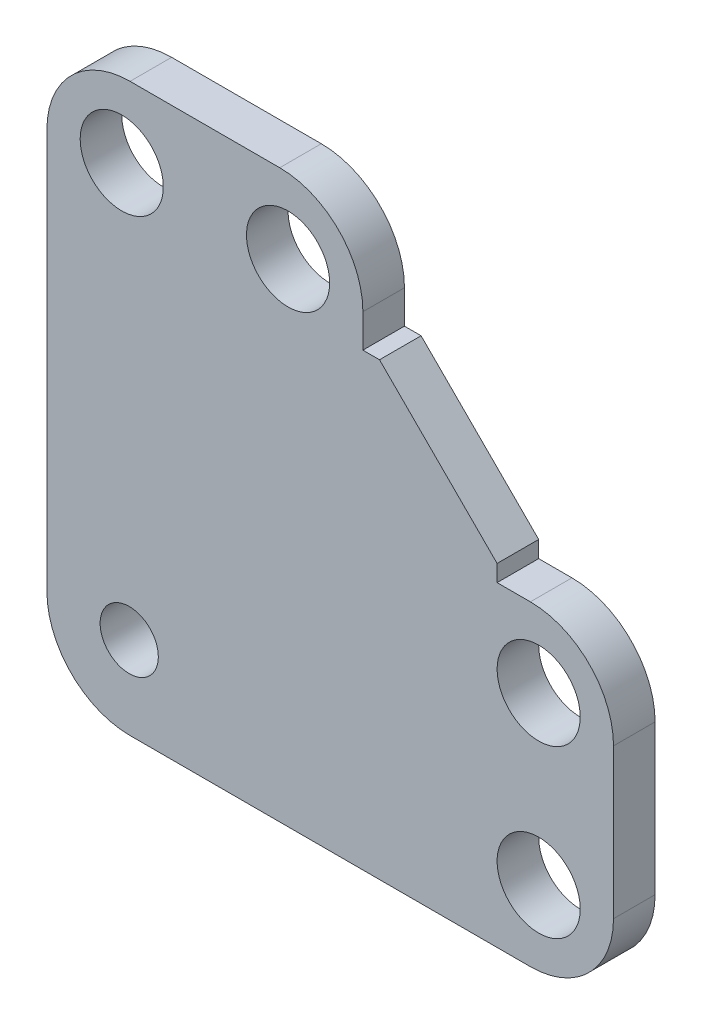
ISO-10303-21;
HEADER;
FILE_DESCRIPTION(('STEP AP214'),'2;1');
FILE_NAME('part.step','',(''),(''),'','','');
FILE_SCHEMA(('AUTOMOTIVE_DESIGN { 1 0 10303 214 1 1 1 1 }'));
ENDSEC;
DATA;
#1=APPLICATION_CONTEXT('core data for automotive mechanical design processes');
#2=APPLICATION_PROTOCOL_DEFINITION('international standard','automotive_design',2000,#1);
#3=PRODUCT_CONTEXT('',#1,'mechanical');
#4=PRODUCT('Part','Part','',(#3));
#5=PRODUCT_RELATED_PRODUCT_CATEGORY('part','',(#4));
#6=PRODUCT_DEFINITION_FORMATION('','',#4);
#7=PRODUCT_DEFINITION_CONTEXT('part definition',#1,'design');
#8=PRODUCT_DEFINITION('design','',#6,#7);
#9=PRODUCT_DEFINITION_SHAPE('','',#8);
#10=(LENGTH_UNIT() NAMED_UNIT(*) SI_UNIT(.MILLI.,.METRE.));
#11=(NAMED_UNIT(*) PLANE_ANGLE_UNIT() SI_UNIT($,.RADIAN.));
#12=(NAMED_UNIT(*) SI_UNIT($,.STERADIAN.) SOLID_ANGLE_UNIT());
#13=UNCERTAINTY_MEASURE_WITH_UNIT(LENGTH_MEASURE(1.E-05),#10,'distance_accuracy_value','');
#14=(GEOMETRIC_REPRESENTATION_CONTEXT(3) GLOBAL_UNCERTAINTY_ASSIGNED_CONTEXT((#13)) GLOBAL_UNIT_ASSIGNED_CONTEXT((#10,
#11,#12)) REPRESENTATION_CONTEXT('',''));
#15=CARTESIAN_POINT('',(0.,0.,0.));
#16=DIRECTION('',(0.,0.,1.));
#17=DIRECTION('',(1.,0.,0.));
#18=AXIS2_PLACEMENT_3D('',#15,#16,#17);
#19=CARTESIAN_POINT('',(54.1421356237309,0.,5.));
#20=DIRECTION('',(-1.,0.,0.));
#21=DIRECTION('',(0.,0.,1.));
#22=AXIS2_PLACEMENT_3D('',#19,#20,#21);
#23=PLANE('',#22);
#24=DIRECTION('',(0.,0.,1.));
#25=VECTOR('',#24,1.);
#26=CARTESIAN_POINT('',(54.1421356237309,38.,0.));
#27=LINE('',#26,#25);
#28=CARTESIAN_POINT('',(54.1421356237309,38.,0.));
#29=VERTEX_POINT('',#28);
#30=CARTESIAN_POINT('',(54.1421356237309,38.,5.));
#31=VERTEX_POINT('',#30);
#32=EDGE_CURVE('E149',#29,#31,#27,.T.);
#33=ORIENTED_EDGE('',*,*,#32,.F.);
#34=DIRECTION('',(0.,1.,0.));
#35=VECTOR('',#34,1.);
#36=CARTESIAN_POINT('',(54.1421356237309,0.,0.));
#37=LINE('',#36,#35);
#38=CARTESIAN_POINT('',(54.1421356237309,40.,0.));
#39=VERTEX_POINT('',#38);
#40=EDGE_CURVE('E193',#29,#39,#37,.T.);
#41=ORIENTED_EDGE('',*,*,#40,.T.);
#42=DIRECTION('',(0.,0.,-1.));
#43=VECTOR('',#42,1.);
#44=CARTESIAN_POINT('',(54.1421356237309,40.,5.));
#45=LINE('',#44,#43);
#46=CARTESIAN_POINT('',(54.1421356237309,40.,5.));
#47=VERTEX_POINT('',#46);
#48=EDGE_CURVE('E152',#47,#39,#45,.T.);
#49=ORIENTED_EDGE('',*,*,#48,.F.);
#50=DIRECTION('',(0.,1.,0.));
#51=VECTOR('',#50,1.);
#52=CARTESIAN_POINT('',(54.1421356237309,0.,5.));
#53=LINE('',#52,#51);
#54=EDGE_CURVE('E139',#31,#47,#53,.T.);
#55=ORIENTED_EDGE('',*,*,#54,.F.);
#56=EDGE_LOOP('',(#33,#41,#49,#55));
#57=FACE_BOUND('',#56,.T.);
#58=ADVANCED_FACE('F33',(#57),#23,.F.);
#59=CARTESIAN_POINT('',(0.,54.1421356237309,5.));
#60=DIRECTION('',(1.,0.,0.));
#61=DIRECTION('',(0.,1.,0.));
#62=AXIS2_PLACEMENT_3D('',#59,#60,#61);
#63=PLANE('',#62);
#64=DIRECTION('',(0.,-1.,0.));
#65=VECTOR('',#64,1.);
#66=CARTESIAN_POINT('',(0.,54.1421356237309,5.));
#67=LINE('',#66,#65);
#68=CARTESIAN_POINT('',(0.,58.1421356237309,5.));
#69=VERTEX_POINT('',#68);
#70=CARTESIAN_POINT('',(0.,10.,5.));
#71=VERTEX_POINT('',#70);
#72=EDGE_CURVE('E178',#69,#71,#67,.T.);
#73=ORIENTED_EDGE('',*,*,#72,.F.);
#74=DIRECTION('',(0.,0.,1.));
#75=VECTOR('',#74,1.);
#76=CARTESIAN_POINT('',(0.,58.1421356237309,0.));
#77=LINE('',#76,#75);
#78=CARTESIAN_POINT('',(0.,58.1421356237309,0.));
#79=VERTEX_POINT('',#78);
#80=EDGE_CURVE('E41',#69,#79,#77,.F.);
#81=ORIENTED_EDGE('',*,*,#80,.T.);
#82=DIRECTION('',(0.,-1.,0.));
#83=VECTOR('',#82,1.);
#84=CARTESIAN_POINT('',(0.,54.1421356237309,0.));
#85=LINE('',#84,#83);
#86=CARTESIAN_POINT('',(0.,10.,0.));
#87=VERTEX_POINT('',#86);
#88=EDGE_CURVE('E177',#79,#87,#85,.T.);
#89=ORIENTED_EDGE('',*,*,#88,.T.);
#90=DIRECTION('',(0.,0.,-1.));
#91=VECTOR('',#90,1.);
#92=CARTESIAN_POINT('',(0.,10.,5.));
#93=LINE('',#92,#91);
#94=EDGE_CURVE('E237',#87,#71,#93,.F.);
#95=ORIENTED_EDGE('',*,*,#94,.T.);
#96=EDGE_LOOP('',(#73,#81,#89,#95));
#97=FACE_BOUND('',#96,.T.);
#98=ADVANCED_FACE('F242',(#97),#63,.F.);
#99=CARTESIAN_POINT('',(0.,0.,5.));
#100=DIRECTION('',(0.,1.,0.));
#101=DIRECTION('',(-1.,0.,0.));
#102=AXIS2_PLACEMENT_3D('',#99,#100,#101);
#103=PLANE('',#102);
#104=DIRECTION('',(1.,0.,0.));
#105=VECTOR('',#104,1.);
#106=CARTESIAN_POINT('',(0.,0.,0.));
#107=LINE('',#106,#105);
#108=CARTESIAN_POINT('',(10.,0.,0.));
#109=VERTEX_POINT('',#108);
#110=CARTESIAN_POINT('',(58.1421356237309,0.,0.));
#111=VERTEX_POINT('',#110);
#112=EDGE_CURVE('E190',#109,#111,#107,.T.);
#113=ORIENTED_EDGE('',*,*,#112,.T.);
#114=DIRECTION('',(0.,0.,1.));
#115=VECTOR('',#114,1.);
#116=CARTESIAN_POINT('',(58.1421356237309,0.,5.));
#117=LINE('',#116,#115);
#118=CARTESIAN_POINT('',(58.1421356237309,0.,5.));
#119=VERTEX_POINT('',#118);
#120=EDGE_CURVE('E205',#111,#119,#117,.T.);
#121=ORIENTED_EDGE('',*,*,#120,.T.);
#122=DIRECTION('',(1.,0.,0.));
#123=VECTOR('',#122,1.);
#124=CARTESIAN_POINT('',(0.,0.,5.));
#125=LINE('',#124,#123);
#126=CARTESIAN_POINT('',(10.,0.,5.));
#127=VERTEX_POINT('',#126);
#128=EDGE_CURVE('E155',#127,#119,#125,.T.);
#129=ORIENTED_EDGE('',*,*,#128,.F.);
#130=DIRECTION('',(0.,0.,-1.));
#131=VECTOR('',#130,1.);
#132=CARTESIAN_POINT('',(10.,0.,5.));
#133=LINE('',#132,#131);
#134=EDGE_CURVE('E202',#127,#109,#133,.T.);
#135=ORIENTED_EDGE('',*,*,#134,.T.);
#136=EDGE_LOOP('',(#113,#121,#129,#135));
#137=FACE_BOUND('',#136,.T.);
#138=ADVANCED_FACE('F350',(#137),#103,.F.);
#139=CARTESIAN_POINT('',(54.1421356237309,40.,5.));
#140=DIRECTION('',(-0.707106781186546,-0.707106781186549,0.));
#141=DIRECTION('',(0.707106781186549,-0.707106781186546,0.));
#142=AXIS2_PLACEMENT_3D('',#139,#140,#141);
#143=PLANE('',#142);
#144=DIRECTION('',(-0.707106781186549,0.707106781186546,0.));
#145=VECTOR('',#144,1.);
#146=CARTESIAN_POINT('',(54.1421356237309,40.,0.));
#147=LINE('',#146,#145);
#148=CARTESIAN_POINT('',(39.9999999999999,54.1421356237309,0.));
#149=VERTEX_POINT('',#148);
#150=EDGE_CURVE('E195',#39,#149,#147,.T.);
#151=ORIENTED_EDGE('',*,*,#150,.T.);
#152=DIRECTION('',(0.,0.,-1.));
#153=VECTOR('',#152,1.);
#154=CARTESIAN_POINT('',(39.9999999999999,54.1421356237309,5.));
#155=LINE('',#154,#153);
#156=CARTESIAN_POINT('',(39.9999999999999,54.1421356237309,5.));
#157=VERTEX_POINT('',#156);
#158=EDGE_CURVE('E187',#157,#149,#155,.T.);
#159=ORIENTED_EDGE('',*,*,#158,.F.);
#160=DIRECTION('',(-0.707106781186549,0.707106781186546,0.));
#161=VECTOR('',#160,1.);
#162=CARTESIAN_POINT('',(54.1421356237309,40.,5.));
#163=LINE('',#162,#161);
#164=EDGE_CURVE('E154',#47,#157,#163,.T.);
#165=ORIENTED_EDGE('',*,*,#164,.F.);
#166=ORIENTED_EDGE('',*,*,#48,.T.);
#167=EDGE_LOOP('',(#151,#159,#165,#166));
#168=FACE_BOUND('',#167,.T.);
#169=ADVANCED_FACE('F267',(#168),#143,.F.);
#170=CARTESIAN_POINT('',(39.9999999999999,54.1421356237309,5.));
#171=DIRECTION('',(0.,-1.,0.));
#172=DIRECTION('',(1.,0.,0.));
#173=AXIS2_PLACEMENT_3D('',#170,#171,#172);
#174=PLANE('',#173);
#175=DIRECTION('',(-1.,0.,0.));
#176=VECTOR('',#175,1.);
#177=CARTESIAN_POINT('',(39.9999999999999,54.1421356237309,0.));
#178=LINE('',#177,#176);
#179=CARTESIAN_POINT('',(37.9999999999999,54.1421356237309,0.));
#180=VERTEX_POINT('',#179);
#181=EDGE_CURVE('E181',#149,#180,#178,.T.);
#182=ORIENTED_EDGE('',*,*,#181,.T.);
#183=DIRECTION('',(0.,0.,1.));
#184=VECTOR('',#183,1.);
#185=CARTESIAN_POINT('',(37.9999999999999,54.1421356237309,0.));
#186=LINE('',#185,#184);
#187=CARTESIAN_POINT('',(37.9999999999999,54.1421356237309,5.));
#188=VERTEX_POINT('',#187);
#189=EDGE_CURVE('E171',#180,#188,#186,.T.);
#190=ORIENTED_EDGE('',*,*,#189,.T.);
#191=DIRECTION('',(-1.,0.,0.));
#192=VECTOR('',#191,1.);
#193=CARTESIAN_POINT('',(39.9999999999999,54.1421356237309,5.));
#194=LINE('',#193,#192);
#195=EDGE_CURVE('E184',#157,#188,#194,.T.);
#196=ORIENTED_EDGE('',*,*,#195,.F.);
#197=ORIENTED_EDGE('',*,*,#158,.T.);
#198=EDGE_LOOP('',(#182,#190,#196,#197));
#199=FACE_BOUND('',#198,.T.);
#200=ADVANCED_FACE('F263',(#199),#174,.F.);
#201=CARTESIAN_POINT('',(0.,0.,5.));
#202=DIRECTION('',(0.,0.,1.));
#203=DIRECTION('',(1.,0.,0.));
#204=AXIS2_PLACEMENT_3D('',#201,#202,#203);
#205=PLANE('',#204);
#206=CARTESIAN_POINT('',(9.89949493661165,9.89949493661168,5.));
#207=DIRECTION('',(0.,0.,1.));
#208=DIRECTION('',(1.,0.,0.));
#209=AXIS2_PLACEMENT_3D('',#206,#207,#208);
#210=CIRCLE('',#209,3.5);
#211=CARTESIAN_POINT('',(13.3994949366117,9.89949493661168,5.));
#212=VERTEX_POINT('',#211);
#213=EDGE_CURVE('E298',#212,#212,#210,.T.);
#214=ORIENTED_EDGE('',*,*,#213,.F.);
#215=EDGE_LOOP('',(#214));
#216=FACE_BOUND('',#215,.T.);
#217=CARTESIAN_POINT('',(59.1421356237309,29.,5.));
#218=DIRECTION('',(0.,0.,1.));
#219=DIRECTION('',(-1.,0.,0.));
#220=AXIS2_PLACEMENT_3D('',#217,#218,#219);
#221=CIRCLE('',#220,5.);
#222=CARTESIAN_POINT('',(54.1421356237309,29.,5.));
#223=VERTEX_POINT('',#222);
#224=EDGE_CURVE('E304',#223,#223,#221,.T.);
#225=ORIENTED_EDGE('',*,*,#224,.F.);
#226=EDGE_LOOP('',(#225));
#227=FACE_BOUND('',#226,.T.);
#228=CARTESIAN_POINT('',(59.1421356237309,9.,5.));
#229=DIRECTION('',(0.,0.,1.));
#230=DIRECTION('',(1.,0.,0.));
#231=AXIS2_PLACEMENT_3D('',#228,#229,#230);
#232=CIRCLE('',#231,5.00000000000001);
#233=CARTESIAN_POINT('',(64.1421356237309,9.,5.));
#234=VERTEX_POINT('',#233);
#235=EDGE_CURVE('E286',#234,#234,#232,.T.);
#236=ORIENTED_EDGE('',*,*,#235,.F.);
#237=EDGE_LOOP('',(#236));
#238=FACE_BOUND('',#237,.T.);
#239=CARTESIAN_POINT('',(8.99999999999997,59.1421356237309,5.));
#240=DIRECTION('',(0.,0.,1.));
#241=DIRECTION('',(-1.,0.,0.));
#242=AXIS2_PLACEMENT_3D('',#239,#240,#241);
#243=CIRCLE('',#242,5.);
#244=CARTESIAN_POINT('',(3.99999999999997,59.1421356237309,5.));
#245=VERTEX_POINT('',#244);
#246=EDGE_CURVE('E293',#245,#245,#243,.T.);
#247=ORIENTED_EDGE('',*,*,#246,.F.);
#248=EDGE_LOOP('',(#247));
#249=FACE_BOUND('',#248,.T.);
#250=CARTESIAN_POINT('',(29.,59.1421356237309,5.));
#251=DIRECTION('',(0.,0.,1.));
#252=DIRECTION('',(1.,0.,0.));
#253=AXIS2_PLACEMENT_3D('',#250,#251,#252);
#254=CIRCLE('',#253,4.99999999999999);
#255=CARTESIAN_POINT('',(34.,59.1421356237309,5.));
#256=VERTEX_POINT('',#255);
#257=EDGE_CURVE('E279',#256,#256,#254,.T.);
#258=ORIENTED_EDGE('',*,*,#257,.F.);
#259=EDGE_LOOP('',(#258));
#260=FACE_BOUND('',#259,.T.);
#261=ORIENTED_EDGE('',*,*,#128,.T.);
#262=CARTESIAN_POINT('',(58.1421356237309,10.,5.));
#263=DIRECTION('',(0.,0.,1.));
#264=DIRECTION('',(1.,0.,0.));
#265=AXIS2_PLACEMENT_3D('',#262,#263,#264);
#266=CIRCLE('',#265,10.);
#267=CARTESIAN_POINT('',(68.1421356237309,10.,5.));
#268=VERTEX_POINT('',#267);
#269=EDGE_CURVE('E215',#119,#268,#266,.T.);
#270=ORIENTED_EDGE('',*,*,#269,.T.);
#271=DIRECTION('',(0.,1.,0.));
#272=VECTOR('',#271,1.);
#273=CARTESIAN_POINT('',(68.1421356237309,0.,5.));
#274=LINE('',#273,#272);
#275=CARTESIAN_POINT('',(68.1421356237309,28.,5.));
#276=VERTEX_POINT('',#275);
#277=EDGE_CURVE('E145',#268,#276,#274,.T.);
#278=ORIENTED_EDGE('',*,*,#277,.T.);
#279=CARTESIAN_POINT('',(58.1421356237309,28.,5.));
#280=DIRECTION('',(0.,0.,1.));
#281=DIRECTION('',(1.,0.,0.));
#282=AXIS2_PLACEMENT_3D('',#279,#280,#281);
#283=CIRCLE('',#282,10.);
#284=CARTESIAN_POINT('',(58.1421356237309,38.,5.));
#285=VERTEX_POINT('',#284);
#286=EDGE_CURVE('E142',#276,#285,#283,.T.);
#287=ORIENTED_EDGE('',*,*,#286,.T.);
#288=DIRECTION('',(-1.,0.,0.));
#289=VECTOR('',#288,1.);
#290=CARTESIAN_POINT('',(54.1421356237309,38.,5.));
#291=LINE('',#290,#289);
#292=EDGE_CURVE('E135',#285,#31,#291,.T.);
#293=ORIENTED_EDGE('',*,*,#292,.T.);
#294=ORIENTED_EDGE('',*,*,#54,.T.);
#295=ORIENTED_EDGE('',*,*,#164,.T.);
#296=ORIENTED_EDGE('',*,*,#195,.T.);
#297=DIRECTION('',(0.,1.,0.));
#298=VECTOR('',#297,1.);
#299=CARTESIAN_POINT('',(37.9999999999999,54.1421356237309,5.));
#300=LINE('',#299,#298);
#301=CARTESIAN_POINT('',(37.9999999999999,58.1421356237309,5.));
#302=VERTEX_POINT('',#301);
#303=EDGE_CURVE('E159',#188,#302,#300,.T.);
#304=ORIENTED_EDGE('',*,*,#303,.T.);
#305=CARTESIAN_POINT('',(27.9999999999999,58.1421356237309,5.));
#306=DIRECTION('',(0.,0.,1.));
#307=DIRECTION('',(1.,0.,0.));
#308=AXIS2_PLACEMENT_3D('',#305,#306,#307);
#309=CIRCLE('',#308,10.);
#310=CARTESIAN_POINT('',(27.9999999999999,68.1421356237309,5.));
#311=VERTEX_POINT('',#310);
#312=EDGE_CURVE('E210',#302,#311,#309,.T.);
#313=ORIENTED_EDGE('',*,*,#312,.T.);
#314=DIRECTION('',(-1.,0.,0.));
#315=VECTOR('',#314,1.);
#316=CARTESIAN_POINT('',(0.,68.1421356237309,5.));
#317=LINE('',#316,#315);
#318=CARTESIAN_POINT('',(10.,68.1421356237309,5.));
#319=VERTEX_POINT('',#318);
#320=EDGE_CURVE('E162',#311,#319,#317,.T.);
#321=ORIENTED_EDGE('',*,*,#320,.T.);
#322=CARTESIAN_POINT('',(10.,58.1421356237309,5.));
#323=DIRECTION('',(0.,0.,1.));
#324=DIRECTION('',(1.,0.,0.));
#325=AXIS2_PLACEMENT_3D('',#322,#323,#324);
#326=CIRCLE('',#325,10.);
#327=EDGE_CURVE('E212',#319,#69,#326,.T.);
#328=ORIENTED_EDGE('',*,*,#327,.T.);
#329=ORIENTED_EDGE('',*,*,#72,.T.);
#330=CARTESIAN_POINT('',(10.,10.,5.));
#331=DIRECTION('',(0.,0.,1.));
#332=DIRECTION('',(1.,0.,0.));
#333=AXIS2_PLACEMENT_3D('',#330,#331,#332);
#334=CIRCLE('',#333,10.);
#335=EDGE_CURVE('E208',#71,#127,#334,.T.);
#336=ORIENTED_EDGE('',*,*,#335,.T.);
#337=EDGE_LOOP('',(#261,#270,#278,#287,#293,#294,#295,#296,#304,#313,#321,#328,#329,#336));
#338=FACE_BOUND('',#337,.T.);
#339=ADVANCED_FACE('F138',(#216,#227,#238,#249,#260,#338),#205,.T.);
#340=CARTESIAN_POINT('',(0.,0.,0.));
#341=DIRECTION('',(0.,0.,1.));
#342=DIRECTION('',(1.,0.,0.));
#343=AXIS2_PLACEMENT_3D('',#340,#341,#342);
#344=PLANE('',#343);
#345=CARTESIAN_POINT('',(9.89949493661165,9.89949493661168,0.));
#346=DIRECTION('',(0.,0.,1.));
#347=DIRECTION('',(1.,0.,0.));
#348=AXIS2_PLACEMENT_3D('',#345,#346,#347);
#349=CIRCLE('',#348,3.5);
#350=CARTESIAN_POINT('',(13.3994949366117,9.89949493661168,0.));
#351=VERTEX_POINT('',#350);
#352=EDGE_CURVE('E301',#351,#351,#349,.T.);
#353=ORIENTED_EDGE('',*,*,#352,.T.);
#354=EDGE_LOOP('',(#353));
#355=FACE_BOUND('',#354,.T.);
#356=CARTESIAN_POINT('',(59.1421356237309,29.,0.));
#357=DIRECTION('',(0.,0.,1.));
#358=DIRECTION('',(-1.,0.,0.));
#359=AXIS2_PLACEMENT_3D('',#356,#357,#358);
#360=CIRCLE('',#359,5.);
#361=CARTESIAN_POINT('',(54.1421356237309,29.,0.));
#362=VERTEX_POINT('',#361);
#363=EDGE_CURVE('E290',#362,#362,#360,.T.);
#364=ORIENTED_EDGE('',*,*,#363,.T.);
#365=EDGE_LOOP('',(#364));
#366=FACE_BOUND('',#365,.T.);
#367=CARTESIAN_POINT('',(59.1421356237309,9.,0.));
#368=DIRECTION('',(0.,0.,1.));
#369=DIRECTION('',(1.,0.,0.));
#370=AXIS2_PLACEMENT_3D('',#367,#368,#369);
#371=CIRCLE('',#370,5.00000000000001);
#372=CARTESIAN_POINT('',(64.1421356237309,9.,0.));
#373=VERTEX_POINT('',#372);
#374=EDGE_CURVE('E289',#373,#373,#371,.T.);
#375=ORIENTED_EDGE('',*,*,#374,.T.);
#376=EDGE_LOOP('',(#375));
#377=FACE_BOUND('',#376,.T.);
#378=CARTESIAN_POINT('',(8.99999999999997,59.1421356237309,0.));
#379=DIRECTION('',(0.,0.,1.));
#380=DIRECTION('',(-1.,0.,0.));
#381=AXIS2_PLACEMENT_3D('',#378,#379,#380);
#382=CIRCLE('',#381,5.);
#383=CARTESIAN_POINT('',(3.99999999999997,59.1421356237309,0.));
#384=VERTEX_POINT('',#383);
#385=EDGE_CURVE('E284',#384,#384,#382,.T.);
#386=ORIENTED_EDGE('',*,*,#385,.T.);
#387=EDGE_LOOP('',(#386));
#388=FACE_BOUND('',#387,.T.);
#389=CARTESIAN_POINT('',(29.,59.1421356237309,0.));
#390=DIRECTION('',(0.,0.,1.));
#391=DIRECTION('',(1.,0.,0.));
#392=AXIS2_PLACEMENT_3D('',#389,#390,#391);
#393=CIRCLE('',#392,4.99999999999999);
#394=CARTESIAN_POINT('',(34.,59.1421356237309,0.));
#395=VERTEX_POINT('',#394);
#396=EDGE_CURVE('E277',#395,#395,#393,.T.);
#397=ORIENTED_EDGE('',*,*,#396,.T.);
#398=EDGE_LOOP('',(#397));
#399=FACE_BOUND('',#398,.T.);
#400=DIRECTION('',(0.,1.,0.));
#401=VECTOR('',#400,1.);
#402=CARTESIAN_POINT('',(68.1421356237309,0.,0.));
#403=LINE('',#402,#401);
#404=CARTESIAN_POINT('',(68.1421356237309,10.,0.));
#405=VERTEX_POINT('',#404);
#406=CARTESIAN_POINT('',(68.1421356237309,28.,0.));
#407=VERTEX_POINT('',#406);
#408=EDGE_CURVE('E144',#405,#407,#403,.T.);
#409=ORIENTED_EDGE('',*,*,#408,.F.);
#410=CARTESIAN_POINT('',(58.1421356237309,10.,0.));
#411=DIRECTION('',(0.,0.,1.));
#412=DIRECTION('',(1.,0.,0.));
#413=AXIS2_PLACEMENT_3D('',#410,#411,#412);
#414=CIRCLE('',#413,10.);
#415=EDGE_CURVE('E229',#405,#111,#414,.F.);
#416=ORIENTED_EDGE('',*,*,#415,.T.);
#417=ORIENTED_EDGE('',*,*,#112,.F.);
#418=CARTESIAN_POINT('',(10.,10.,0.));
#419=DIRECTION('',(0.,0.,1.));
#420=DIRECTION('',(1.,0.,0.));
#421=AXIS2_PLACEMENT_3D('',#418,#419,#420);
#422=CIRCLE('',#421,10.);
#423=EDGE_CURVE('E222',#109,#87,#422,.F.);
#424=ORIENTED_EDGE('',*,*,#423,.T.);
#425=ORIENTED_EDGE('',*,*,#88,.F.);
#426=CARTESIAN_POINT('',(10.,58.1421356237309,0.));
#427=DIRECTION('',(0.,0.,1.));
#428=DIRECTION('',(1.,0.,0.));
#429=AXIS2_PLACEMENT_3D('',#426,#427,#428);
#430=CIRCLE('',#429,10.);
#431=CARTESIAN_POINT('',(10.,68.1421356237309,0.));
#432=VERTEX_POINT('',#431);
#433=EDGE_CURVE('E225',#79,#432,#430,.F.);
#434=ORIENTED_EDGE('',*,*,#433,.T.);
#435=DIRECTION('',(-1.,0.,0.));
#436=VECTOR('',#435,1.);
#437=CARTESIAN_POINT('',(0.,68.1421356237309,0.));
#438=LINE('',#437,#436);
#439=CARTESIAN_POINT('',(27.9999999999999,68.1421356237309,0.));
#440=VERTEX_POINT('',#439);
#441=EDGE_CURVE('E169',#440,#432,#438,.T.);
#442=ORIENTED_EDGE('',*,*,#441,.F.);
#443=CARTESIAN_POINT('',(27.9999999999999,58.1421356237309,0.));
#444=DIRECTION('',(0.,0.,1.));
#445=DIRECTION('',(1.,0.,0.));
#446=AXIS2_PLACEMENT_3D('',#443,#444,#445);
#447=CIRCLE('',#446,10.);
#448=CARTESIAN_POINT('',(37.9999999999999,58.1421356237309,0.));
#449=VERTEX_POINT('',#448);
#450=EDGE_CURVE('E56',#440,#449,#447,.F.);
#451=ORIENTED_EDGE('',*,*,#450,.T.);
#452=DIRECTION('',(0.,1.,0.));
#453=VECTOR('',#452,1.);
#454=CARTESIAN_POINT('',(37.9999999999999,54.1421356237309,0.));
#455=LINE('',#454,#453);
#456=EDGE_CURVE('E167',#180,#449,#455,.T.);
#457=ORIENTED_EDGE('',*,*,#456,.F.);
#458=ORIENTED_EDGE('',*,*,#181,.F.);
#459=ORIENTED_EDGE('',*,*,#150,.F.);
#460=ORIENTED_EDGE('',*,*,#40,.F.);
#461=DIRECTION('',(-1.,0.,0.));
#462=VECTOR('',#461,1.);
#463=CARTESIAN_POINT('',(54.1421356237309,38.,0.));
#464=LINE('',#463,#462);
#465=CARTESIAN_POINT('',(58.1421356237309,38.,0.));
#466=VERTEX_POINT('',#465);
#467=EDGE_CURVE('E158',#466,#29,#464,.T.);
#468=ORIENTED_EDGE('',*,*,#467,.F.);
#469=CARTESIAN_POINT('',(58.1421356237309,28.,0.));
#470=DIRECTION('',(0.,0.,1.));
#471=DIRECTION('',(1.,0.,0.));
#472=AXIS2_PLACEMENT_3D('',#469,#470,#471);
#473=CIRCLE('',#472,10.);
#474=EDGE_CURVE('E227',#466,#407,#473,.F.);
#475=ORIENTED_EDGE('',*,*,#474,.T.);
#476=EDGE_LOOP('',(#409,#416,#417,#424,#425,#434,#442,#451,#457,#458,#459,#460,#468,#475));
#477=FACE_BOUND('',#476,.T.);
#478=ADVANCED_FACE('F247',(#355,#366,#377,#388,#399,#477),#344,.F.);
#479=CARTESIAN_POINT('',(0.,68.1421356237309,0.));
#480=DIRECTION('',(0.,1.,0.));
#481=DIRECTION('',(0.,0.,1.));
#482=AXIS2_PLACEMENT_3D('',#479,#480,#481);
#483=PLANE('',#482);
#484=ORIENTED_EDGE('',*,*,#441,.T.);
#485=DIRECTION('',(0.,0.,1.));
#486=VECTOR('',#485,1.);
#487=CARTESIAN_POINT('',(10.,68.1421356237309,5.));
#488=LINE('',#487,#486);
#489=EDGE_CURVE('E234',#432,#319,#488,.T.);
#490=ORIENTED_EDGE('',*,*,#489,.T.);
#491=ORIENTED_EDGE('',*,*,#320,.F.);
#492=DIRECTION('',(0.,0.,1.));
#493=VECTOR('',#492,1.);
#494=CARTESIAN_POINT('',(27.9999999999999,68.1421356237309,0.));
#495=LINE('',#494,#493);
#496=EDGE_CURVE('E232',#311,#440,#495,.F.);
#497=ORIENTED_EDGE('',*,*,#496,.T.);
#498=EDGE_LOOP('',(#484,#490,#491,#497));
#499=FACE_BOUND('',#498,.T.);
#500=ADVANCED_FACE('F253',(#499),#483,.T.);
#501=CARTESIAN_POINT('',(37.9999999999999,54.1421356237309,0.));
#502=DIRECTION('',(1.,0.,0.));
#503=DIRECTION('',(0.,0.,-1.));
#504=AXIS2_PLACEMENT_3D('',#501,#502,#503);
#505=PLANE('',#504);
#506=ORIENTED_EDGE('',*,*,#456,.T.);
#507=DIRECTION('',(0.,0.,1.));
#508=VECTOR('',#507,1.);
#509=CARTESIAN_POINT('',(37.9999999999999,58.1421356237309,0.));
#510=LINE('',#509,#508);
#511=EDGE_CURVE('E11',#449,#302,#510,.T.);
#512=ORIENTED_EDGE('',*,*,#511,.T.);
#513=ORIENTED_EDGE('',*,*,#303,.F.);
#514=ORIENTED_EDGE('',*,*,#189,.F.);
#515=EDGE_LOOP('',(#506,#512,#513,#514));
#516=FACE_BOUND('',#515,.T.);
#517=ADVANCED_FACE('F259',(#516),#505,.T.);
#518=CARTESIAN_POINT('',(54.1421356237309,38.,0.));
#519=DIRECTION('',(0.,1.,0.));
#520=DIRECTION('',(-1.,0.,0.));
#521=AXIS2_PLACEMENT_3D('',#518,#519,#520);
#522=PLANE('',#521);
#523=ORIENTED_EDGE('',*,*,#292,.F.);
#524=DIRECTION('',(0.,0.,1.));
#525=VECTOR('',#524,1.);
#526=CARTESIAN_POINT('',(58.1421356237309,38.,0.));
#527=LINE('',#526,#525);
#528=EDGE_CURVE('E48',#285,#466,#527,.F.);
#529=ORIENTED_EDGE('',*,*,#528,.T.);
#530=ORIENTED_EDGE('',*,*,#467,.T.);
#531=ORIENTED_EDGE('',*,*,#32,.T.);
#532=EDGE_LOOP('',(#523,#529,#530,#531));
#533=FACE_BOUND('',#532,.T.);
#534=ADVANCED_FACE('F157',(#533),#522,.T.);
#535=CARTESIAN_POINT('',(68.1421356237309,0.,0.));
#536=DIRECTION('',(1.,0.,0.));
#537=DIRECTION('',(0.,1.,0.));
#538=AXIS2_PLACEMENT_3D('',#535,#536,#537);
#539=PLANE('',#538);
#540=ORIENTED_EDGE('',*,*,#277,.F.);
#541=DIRECTION('',(0.,0.,1.));
#542=VECTOR('',#541,1.);
#543=CARTESIAN_POINT('',(68.1421356237309,10.,0.));
#544=LINE('',#543,#542);
#545=EDGE_CURVE('E220',#268,#405,#544,.F.);
#546=ORIENTED_EDGE('',*,*,#545,.T.);
#547=ORIENTED_EDGE('',*,*,#408,.T.);
#548=DIRECTION('',(0.,0.,1.));
#549=VECTOR('',#548,1.);
#550=CARTESIAN_POINT('',(68.1421356237309,28.,0.));
#551=LINE('',#550,#549);
#552=EDGE_CURVE('E217',#407,#276,#551,.T.);
#553=ORIENTED_EDGE('',*,*,#552,.T.);
#554=EDGE_LOOP('',(#540,#546,#547,#553));
#555=FACE_BOUND('',#554,.T.);
#556=ADVANCED_FACE('F275',(#555),#539,.T.);
#557=CARTESIAN_POINT('',(29.,59.1421356237309,0.));
#558=DIRECTION('',(0.,0.,1.));
#559=DIRECTION('',(1.,0.,0.));
#560=AXIS2_PLACEMENT_3D('',#557,#558,#559);
#561=CYLINDRICAL_SURFACE('',#560,4.99999999999999);
#562=ORIENTED_EDGE('',*,*,#396,.F.);
#563=EDGE_LOOP('',(#562));
#564=FACE_BOUND('',#563,.T.);
#565=ORIENTED_EDGE('',*,*,#257,.T.);
#566=EDGE_LOOP('',(#565));
#567=FACE_BOUND('',#566,.T.);
#568=ADVANCED_FACE('F330',(#564,#567),#561,.F.);
#569=CARTESIAN_POINT('',(8.99999999999997,59.1421356237309,0.));
#570=DIRECTION('',(0.,0.,1.));
#571=DIRECTION('',(1.,0.,0.));
#572=AXIS2_PLACEMENT_3D('',#569,#570,#571);
#573=CYLINDRICAL_SURFACE('',#572,5.);
#574=ORIENTED_EDGE('',*,*,#385,.F.);
#575=EDGE_LOOP('',(#574));
#576=FACE_BOUND('',#575,.T.);
#577=ORIENTED_EDGE('',*,*,#246,.T.);
#578=EDGE_LOOP('',(#577));
#579=FACE_BOUND('',#578,.T.);
#580=ADVANCED_FACE('F332',(#576,#579),#573,.F.);
#581=CARTESIAN_POINT('',(59.1421356237309,9.,0.));
#582=DIRECTION('',(0.,0.,1.));
#583=DIRECTION('',(1.,0.,0.));
#584=AXIS2_PLACEMENT_3D('',#581,#582,#583);
#585=CYLINDRICAL_SURFACE('',#584,5.00000000000001);
#586=ORIENTED_EDGE('',*,*,#374,.F.);
#587=EDGE_LOOP('',(#586));
#588=FACE_BOUND('',#587,.T.);
#589=ORIENTED_EDGE('',*,*,#235,.T.);
#590=EDGE_LOOP('',(#589));
#591=FACE_BOUND('',#590,.T.);
#592=ADVANCED_FACE('F316',(#588,#591),#585,.F.);
#593=CARTESIAN_POINT('',(59.1421356237309,29.,0.));
#594=DIRECTION('',(0.,0.,1.));
#595=DIRECTION('',(1.,0.,0.));
#596=AXIS2_PLACEMENT_3D('',#593,#594,#595);
#597=CYLINDRICAL_SURFACE('',#596,5.);
#598=ORIENTED_EDGE('',*,*,#363,.F.);
#599=EDGE_LOOP('',(#598));
#600=FACE_BOUND('',#599,.T.);
#601=ORIENTED_EDGE('',*,*,#224,.T.);
#602=EDGE_LOOP('',(#601));
#603=FACE_BOUND('',#602,.T.);
#604=ADVANCED_FACE('F312',(#600,#603),#597,.F.);
#605=CARTESIAN_POINT('',(9.89949493661165,9.89949493661168,0.));
#606=DIRECTION('',(0.,0.,1.));
#607=DIRECTION('',(1.,0.,0.));
#608=AXIS2_PLACEMENT_3D('',#605,#606,#607);
#609=CYLINDRICAL_SURFACE('',#608,3.5);
#610=ORIENTED_EDGE('',*,*,#352,.F.);
#611=EDGE_LOOP('',(#610));
#612=FACE_BOUND('',#611,.T.);
#613=ORIENTED_EDGE('',*,*,#213,.T.);
#614=EDGE_LOOP('',(#613));
#615=FACE_BOUND('',#614,.T.);
#616=ADVANCED_FACE('F315',(#612,#615),#609,.F.);
#617=CARTESIAN_POINT('',(58.1421356237309,10.,5.));
#618=DIRECTION('',(0.,0.,-1.));
#619=DIRECTION('',(-1.,0.,0.));
#620=AXIS2_PLACEMENT_3D('',#617,#618,#619);
#621=CYLINDRICAL_SURFACE('',#620,10.);
#622=ORIENTED_EDGE('',*,*,#415,.F.);
#623=ORIENTED_EDGE('',*,*,#545,.F.);
#624=ORIENTED_EDGE('',*,*,#269,.F.);
#625=ORIENTED_EDGE('',*,*,#120,.F.);
#626=EDGE_LOOP('',(#622,#623,#624,#625));
#627=FACE_BOUND('',#626,.T.);
#628=ADVANCED_FACE('F358',(#627),#621,.T.);
#629=CARTESIAN_POINT('',(58.1421356237309,28.,0.));
#630=DIRECTION('',(0.,0.,1.));
#631=DIRECTION('',(1.,0.,0.));
#632=AXIS2_PLACEMENT_3D('',#629,#630,#631);
#633=CYLINDRICAL_SURFACE('',#632,10.);
#634=ORIENTED_EDGE('',*,*,#474,.F.);
#635=ORIENTED_EDGE('',*,*,#528,.F.);
#636=ORIENTED_EDGE('',*,*,#286,.F.);
#637=ORIENTED_EDGE('',*,*,#552,.F.);
#638=EDGE_LOOP('',(#634,#635,#636,#637));
#639=FACE_BOUND('',#638,.T.);
#640=ADVANCED_FACE('F272',(#639),#633,.T.);
#641=CARTESIAN_POINT('',(10.,58.1421356237309,0.));
#642=DIRECTION('',(0.,0.,-1.));
#643=DIRECTION('',(-1.,0.,0.));
#644=AXIS2_PLACEMENT_3D('',#641,#642,#643);
#645=CYLINDRICAL_SURFACE('',#644,10.);
#646=ORIENTED_EDGE('',*,*,#433,.F.);
#647=ORIENTED_EDGE('',*,*,#80,.F.);
#648=ORIENTED_EDGE('',*,*,#327,.F.);
#649=ORIENTED_EDGE('',*,*,#489,.F.);
#650=EDGE_LOOP('',(#646,#647,#648,#649));
#651=FACE_BOUND('',#650,.T.);
#652=ADVANCED_FACE('F250',(#651),#645,.T.);
#653=CARTESIAN_POINT('',(27.9999999999999,58.1421356237309,0.));
#654=DIRECTION('',(0.,0.,1.));
#655=DIRECTION('',(1.,0.,0.));
#656=AXIS2_PLACEMENT_3D('',#653,#654,#655);
#657=CYLINDRICAL_SURFACE('',#656,10.);
#658=ORIENTED_EDGE('',*,*,#450,.F.);
#659=ORIENTED_EDGE('',*,*,#496,.F.);
#660=ORIENTED_EDGE('',*,*,#312,.F.);
#661=ORIENTED_EDGE('',*,*,#511,.F.);
#662=EDGE_LOOP('',(#658,#659,#660,#661));
#663=FACE_BOUND('',#662,.T.);
#664=ADVANCED_FACE('F257',(#663),#657,.T.);
#665=CARTESIAN_POINT('',(10.,10.,5.));
#666=DIRECTION('',(0.,0.,-1.));
#667=DIRECTION('',(-1.,0.,0.));
#668=AXIS2_PLACEMENT_3D('',#665,#666,#667);
#669=CYLINDRICAL_SURFACE('',#668,10.);
#670=ORIENTED_EDGE('',*,*,#335,.F.);
#671=ORIENTED_EDGE('',*,*,#94,.F.);
#672=ORIENTED_EDGE('',*,*,#423,.F.);
#673=ORIENTED_EDGE('',*,*,#134,.F.);
#674=EDGE_LOOP('',(#670,#671,#672,#673));
#675=FACE_BOUND('',#674,.T.);
#676=ADVANCED_FACE('F35',(#675),#669,.T.);
#677=CLOSED_SHELL('',(#58,#98,#138,#169,#200,#339,#478,#500,#517,#534,#556,#568,#580,#592,#604,
#616,#628,#640,#652,#664,#676));
#678=MANIFOLD_SOLID_BREP('B2',#677);
#679=ADVANCED_BREP_SHAPE_REPRESENTATION('',(#18,#678),#14);
#680=SHAPE_DEFINITION_REPRESENTATION(#9,#679);
ENDSEC;
END-ISO-10303-21;
